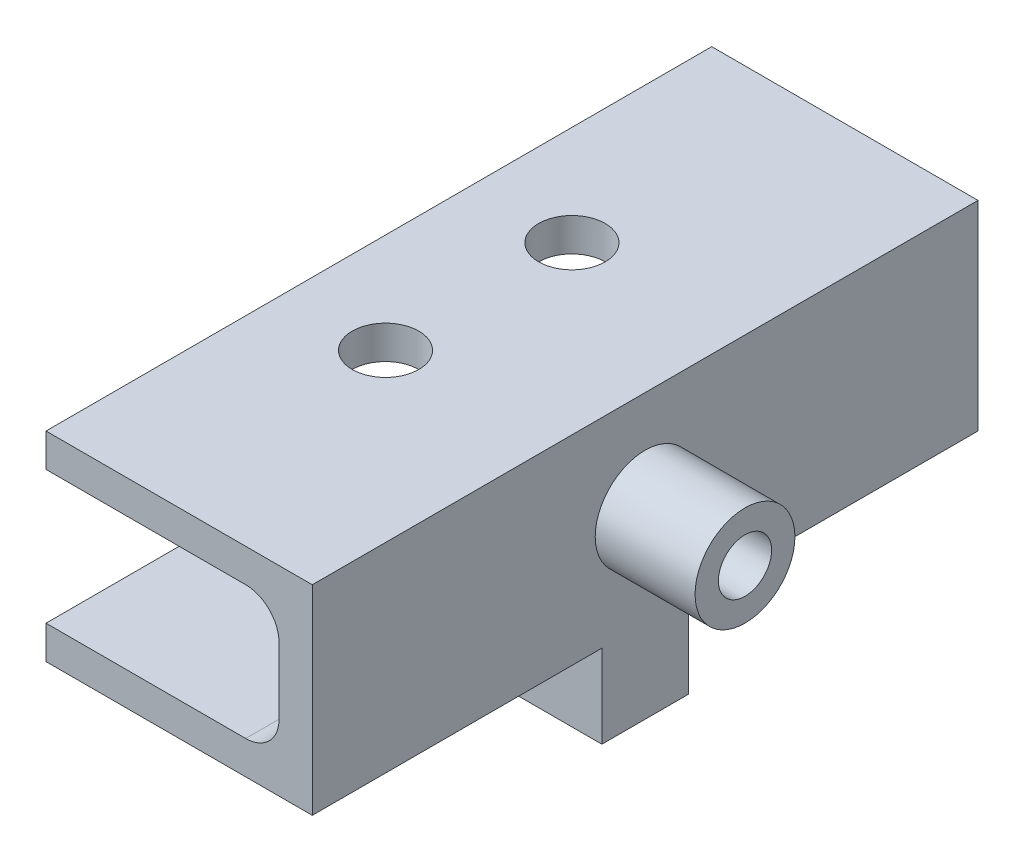
ISO-10303-21;
HEADER;
FILE_DESCRIPTION(('STEP AP214'),'2;1');
FILE_NAME('part.step','',(''),(''),'','','');
FILE_SCHEMA(('AUTOMOTIVE_DESIGN { 1 0 10303 214 1 1 1 1 }'));
ENDSEC;
DATA;
#1=APPLICATION_CONTEXT('core data for automotive mechanical design processes');
#2=APPLICATION_PROTOCOL_DEFINITION('international standard','automotive_design',2000,#1);
#3=PRODUCT_CONTEXT('',#1,'mechanical');
#4=PRODUCT('Part','Part','',(#3));
#5=PRODUCT_RELATED_PRODUCT_CATEGORY('part','',(#4));
#6=PRODUCT_DEFINITION_FORMATION('','',#4);
#7=PRODUCT_DEFINITION_CONTEXT('part definition',#1,'design');
#8=PRODUCT_DEFINITION('design','',#6,#7);
#9=PRODUCT_DEFINITION_SHAPE('','',#8);
#10=(LENGTH_UNIT() NAMED_UNIT(*) SI_UNIT(.MILLI.,.METRE.));
#11=(NAMED_UNIT(*) PLANE_ANGLE_UNIT() SI_UNIT($,.RADIAN.));
#12=(NAMED_UNIT(*) SI_UNIT($,.STERADIAN.) SOLID_ANGLE_UNIT());
#13=UNCERTAINTY_MEASURE_WITH_UNIT(LENGTH_MEASURE(1.E-05),#10,'distance_accuracy_value','');
#14=(GEOMETRIC_REPRESENTATION_CONTEXT(3) GLOBAL_UNCERTAINTY_ASSIGNED_CONTEXT((#13)) GLOBAL_UNIT_ASSIGNED_CONTEXT((#10,
#11,#12)) REPRESENTATION_CONTEXT('',''));
#15=CARTESIAN_POINT('',(0.,0.,0.));
#16=DIRECTION('',(0.,0.,1.));
#17=DIRECTION('',(1.,0.,0.));
#18=AXIS2_PLACEMENT_3D('',#15,#16,#17);
#19=CARTESIAN_POINT('',(0.,-25.,100.));
#20=DIRECTION('',(0.,1.,0.));
#21=DIRECTION('',(0.,0.,1.));
#22=AXIS2_PLACEMENT_3D('',#19,#20,#21);
#23=PLANE('',#22);
#24=CARTESIAN_POINT('',(15.,-25.,64.));
#25=DIRECTION('',(0.,1.,0.));
#26=DIRECTION('',(0.,0.,1.));
#27=AXIS2_PLACEMENT_3D('',#24,#25,#26);
#28=CIRCLE('',#27,5.);
#29=CARTESIAN_POINT('',(15.,-25.,69.));
#30=VERTEX_POINT('',#29);
#31=EDGE_CURVE('E181',#30,#30,#28,.T.);
#32=ORIENTED_EDGE('',*,*,#31,.T.);
#33=EDGE_LOOP('',(#32));
#34=FACE_BOUND('',#33,.T.);
#35=DIRECTION('',(-1.,0.,0.));
#36=VECTOR('',#35,1.);
#37=CARTESIAN_POINT('',(0.,-25.,56.5));
#38=LINE('',#37,#36);
#39=CARTESIAN_POINT('',(40.,-25.,56.5));
#40=VERTEX_POINT('',#39);
#41=CARTESIAN_POINT('',(0.,-25.,56.5));
#42=VERTEX_POINT('',#41);
#43=EDGE_CURVE('E156',#40,#42,#38,.T.);
#44=ORIENTED_EDGE('',*,*,#43,.F.);
#45=DIRECTION('',(0.,0.,-1.));
#46=VECTOR('',#45,1.);
#47=CARTESIAN_POINT('',(40.,-25.,100.));
#48=LINE('',#47,#46);
#49=CARTESIAN_POINT('',(40.,-25.,100.));
#50=VERTEX_POINT('',#49);
#51=EDGE_CURVE('E236',#50,#40,#48,.T.);
#52=ORIENTED_EDGE('',*,*,#51,.F.);
#53=DIRECTION('',(1.,0.,0.));
#54=VECTOR('',#53,1.);
#55=CARTESIAN_POINT('',(0.,-25.,100.));
#56=LINE('',#55,#54);
#57=CARTESIAN_POINT('',(0.,-25.,100.));
#58=VERTEX_POINT('',#57);
#59=EDGE_CURVE('E205',#58,#50,#56,.T.);
#60=ORIENTED_EDGE('',*,*,#59,.F.);
#61=DIRECTION('',(0.,0.,-1.));
#62=VECTOR('',#61,1.);
#63=CARTESIAN_POINT('',(0.,-25.,100.));
#64=LINE('',#63,#62);
#65=EDGE_CURVE('E58',#58,#42,#64,.T.);
#66=ORIENTED_EDGE('',*,*,#65,.T.);
#67=EDGE_LOOP('',(#44,#52,#60,#66));
#68=FACE_BOUND('',#67,.T.);
#69=ADVANCED_FACE('F35',(#34,#68),#23,.F.);
#70=CARTESIAN_POINT('',(15.,-25.,36.));
#71=DIRECTION('',(0.,1.,0.));
#72=DIRECTION('',(0.,0.,1.));
#73=AXIS2_PLACEMENT_3D('',#70,#71,#72);
#74=CIRCLE('',#73,5.);
#75=CARTESIAN_POINT('',(15.,-25.,41.));
#76=VERTEX_POINT('',#75);
#77=EDGE_CURVE('E171',#76,#76,#74,.F.);
#78=ORIENTED_EDGE('',*,*,#77,.F.);
#79=EDGE_LOOP('',(#78));
#80=FACE_BOUND('',#79,.T.);
#81=DIRECTION('',(1.,0.,0.));
#82=VECTOR('',#81,1.);
#83=CARTESIAN_POINT('',(0.,-25.,43.5));
#84=LINE('',#83,#82);
#85=CARTESIAN_POINT('',(0.,-25.,43.5));
#86=VERTEX_POINT('',#85);
#87=CARTESIAN_POINT('',(40.,-25.,43.5));
#88=VERTEX_POINT('',#87);
#89=EDGE_CURVE('E50',#86,#88,#84,.T.);
#90=ORIENTED_EDGE('',*,*,#89,.F.);
#91=CARTESIAN_POINT('',(0.,-25.,0.));
#92=VERTEX_POINT('',#91);
#93=EDGE_CURVE('E160',#86,#92,#64,.T.);
#94=ORIENTED_EDGE('',*,*,#93,.T.);
#95=DIRECTION('',(1.,0.,0.));
#96=VECTOR('',#95,1.);
#97=CARTESIAN_POINT('',(0.,-25.,0.));
#98=LINE('',#97,#96);
#99=CARTESIAN_POINT('',(40.,-25.,0.));
#100=VERTEX_POINT('',#99);
#101=EDGE_CURVE('E224',#92,#100,#98,.T.);
#102=ORIENTED_EDGE('',*,*,#101,.T.);
#103=EDGE_CURVE('E235',#88,#100,#48,.T.);
#104=ORIENTED_EDGE('',*,*,#103,.F.);
#105=EDGE_LOOP('',(#90,#94,#102,#104));
#106=FACE_BOUND('',#105,.T.);
#107=ADVANCED_FACE('F295',(#80,#106),#23,.F.);
#108=CARTESIAN_POINT('',(0.,0.,100.));
#109=DIRECTION('',(0.,1.,0.));
#110=DIRECTION('',(0.,0.,1.));
#111=AXIS2_PLACEMENT_3D('',#108,#109,#110);
#112=PLANE('',#111);
#113=DIRECTION('',(1.,0.,0.));
#114=VECTOR('',#113,1.);
#115=CARTESIAN_POINT('',(0.,0.,0.));
#116=LINE('',#115,#114);
#117=CARTESIAN_POINT('',(0.,0.,0.));
#118=VERTEX_POINT('',#117);
#119=CARTESIAN_POINT('',(30.,0.,0.));
#120=VERTEX_POINT('',#119);
#121=EDGE_CURVE('E214',#118,#120,#116,.T.);
#122=ORIENTED_EDGE('',*,*,#121,.T.);
#123=DIRECTION('',(0.,0.,-1.));
#124=VECTOR('',#123,1.);
#125=CARTESIAN_POINT('',(30.,0.,100.));
#126=LINE('',#125,#124);
#127=CARTESIAN_POINT('',(30.,0.,100.));
#128=VERTEX_POINT('',#127);
#129=EDGE_CURVE('E254',#120,#128,#126,.F.);
#130=ORIENTED_EDGE('',*,*,#129,.T.);
#131=DIRECTION('',(1.,0.,0.));
#132=VECTOR('',#131,1.);
#133=CARTESIAN_POINT('',(0.,0.,100.));
#134=LINE('',#133,#132);
#135=CARTESIAN_POINT('',(0.,0.,100.));
#136=VERTEX_POINT('',#135);
#137=EDGE_CURVE('E194',#136,#128,#134,.T.);
#138=ORIENTED_EDGE('',*,*,#137,.F.);
#139=DIRECTION('',(0.,0.,-1.));
#140=VECTOR('',#139,1.);
#141=CARTESIAN_POINT('',(0.,0.,100.));
#142=LINE('',#141,#140);
#143=EDGE_CURVE('E243',#136,#118,#142,.T.);
#144=ORIENTED_EDGE('',*,*,#143,.T.);
#145=EDGE_LOOP('',(#122,#130,#138,#144));
#146=FACE_BOUND('',#145,.T.);
#147=CARTESIAN_POINT('',(15.,0.,36.));
#148=DIRECTION('',(0.,1.,0.));
#149=DIRECTION('',(0.,0.,1.));
#150=AXIS2_PLACEMENT_3D('',#147,#148,#149);
#151=CIRCLE('',#150,5.);
#152=CARTESIAN_POINT('',(15.,0.,41.));
#153=VERTEX_POINT('',#152);
#154=EDGE_CURVE('E178',#153,#153,#151,.F.);
#155=ORIENTED_EDGE('',*,*,#154,.F.);
#156=EDGE_LOOP('',(#155));
#157=FACE_BOUND('',#156,.T.);
#158=CARTESIAN_POINT('',(15.,0.,64.));
#159=DIRECTION('',(0.,1.,0.));
#160=DIRECTION('',(0.,0.,1.));
#161=AXIS2_PLACEMENT_3D('',#158,#159,#160);
#162=CIRCLE('',#161,5.);
#163=CARTESIAN_POINT('',(15.,0.,69.));
#164=VERTEX_POINT('',#163);
#165=EDGE_CURVE('E187',#164,#164,#162,.T.);
#166=ORIENTED_EDGE('',*,*,#165,.T.);
#167=EDGE_LOOP('',(#166));
#168=FACE_BOUND('',#167,.T.);
#169=ADVANCED_FACE('F277',(#146,#157,#168),#112,.F.);
#170=CARTESIAN_POINT('',(35.,-20.,100.));
#171=DIRECTION('',(0.,-1.,0.));
#172=DIRECTION('',(1.,0.,0.));
#173=AXIS2_PLACEMENT_3D('',#170,#171,#172);
#174=PLANE('',#173);
#175=DIRECTION('',(-1.,0.,0.));
#176=VECTOR('',#175,1.);
#177=CARTESIAN_POINT('',(35.,-20.,100.));
#178=LINE('',#177,#176);
#179=CARTESIAN_POINT('',(30.,-20.,100.));
#180=VERTEX_POINT('',#179);
#181=CARTESIAN_POINT('',(0.,-20.,100.));
#182=VERTEX_POINT('',#181);
#183=EDGE_CURVE('E201',#180,#182,#178,.T.);
#184=ORIENTED_EDGE('',*,*,#183,.F.);
#185=DIRECTION('',(0.,0.,-1.));
#186=VECTOR('',#185,1.);
#187=CARTESIAN_POINT('',(30.,-20.,0.));
#188=LINE('',#187,#186);
#189=CARTESIAN_POINT('',(30.,-20.,0.));
#190=VERTEX_POINT('',#189);
#191=EDGE_CURVE('E246',#180,#190,#188,.T.);
#192=ORIENTED_EDGE('',*,*,#191,.T.);
#193=DIRECTION('',(-1.,0.,0.));
#194=VECTOR('',#193,1.);
#195=CARTESIAN_POINT('',(35.,-20.,0.));
#196=LINE('',#195,#194);
#197=CARTESIAN_POINT('',(0.,-20.,0.));
#198=VERTEX_POINT('',#197);
#199=EDGE_CURVE('E220',#190,#198,#196,.T.);
#200=ORIENTED_EDGE('',*,*,#199,.T.);
#201=DIRECTION('',(0.,0.,-1.));
#202=VECTOR('',#201,1.);
#203=CARTESIAN_POINT('',(0.,-20.,100.));
#204=LINE('',#203,#202);
#205=EDGE_CURVE('E240',#182,#198,#204,.T.);
#206=ORIENTED_EDGE('',*,*,#205,.F.);
#207=EDGE_LOOP('',(#184,#192,#200,#206));
#208=FACE_BOUND('',#207,.T.);
#209=CARTESIAN_POINT('',(15.,-20.,36.));
#210=DIRECTION('',(0.,-1.,0.));
#211=DIRECTION('',(1.,0.,0.));
#212=AXIS2_PLACEMENT_3D('',#209,#210,#211);
#213=CIRCLE('',#212,5.);
#214=CARTESIAN_POINT('',(20.,-20.,36.));
#215=VERTEX_POINT('',#214);
#216=EDGE_CURVE('E175',#215,#215,#213,.F.);
#217=ORIENTED_EDGE('',*,*,#216,.F.);
#218=EDGE_LOOP('',(#217));
#219=FACE_BOUND('',#218,.T.);
#220=CARTESIAN_POINT('',(15.,-20.,64.));
#221=DIRECTION('',(0.,-1.,0.));
#222=DIRECTION('',(1.,0.,0.));
#223=AXIS2_PLACEMENT_3D('',#220,#221,#222);
#224=CIRCLE('',#223,5.);
#225=CARTESIAN_POINT('',(20.,-20.,64.));
#226=VERTEX_POINT('',#225);
#227=EDGE_CURVE('E184',#226,#226,#224,.T.);
#228=ORIENTED_EDGE('',*,*,#227,.T.);
#229=EDGE_LOOP('',(#228));
#230=FACE_BOUND('',#229,.T.);
#231=ADVANCED_FACE('F302',(#208,#219,#230),#174,.F.);
#232=CARTESIAN_POINT('',(40.,5.00000000000001,100.));
#233=DIRECTION('',(0.,-1.,0.));
#234=DIRECTION('',(1.,0.,0.));
#235=AXIS2_PLACEMENT_3D('',#232,#233,#234);
#236=PLANE('',#235);
#237=DIRECTION('',(-1.,0.,0.));
#238=VECTOR('',#237,1.);
#239=CARTESIAN_POINT('',(40.,5.00000000000001,0.));
#240=LINE('',#239,#238);
#241=CARTESIAN_POINT('',(40.,5.00000000000001,0.));
#242=VERTEX_POINT('',#241);
#243=CARTESIAN_POINT('',(0.,5.,0.));
#244=VERTEX_POINT('',#243);
#245=EDGE_CURVE('E195',#242,#244,#240,.T.);
#246=ORIENTED_EDGE('',*,*,#245,.T.);
#247=DIRECTION('',(0.,0.,-1.));
#248=VECTOR('',#247,1.);
#249=CARTESIAN_POINT('',(0.,5.,100.));
#250=LINE('',#249,#248);
#251=CARTESIAN_POINT('',(0.,5.,100.));
#252=VERTEX_POINT('',#251);
#253=EDGE_CURVE('E211',#252,#244,#250,.T.);
#254=ORIENTED_EDGE('',*,*,#253,.F.);
#255=DIRECTION('',(-1.,0.,0.));
#256=VECTOR('',#255,1.);
#257=CARTESIAN_POINT('',(40.,5.00000000000001,100.));
#258=LINE('',#257,#256);
#259=CARTESIAN_POINT('',(40.,5.00000000000001,100.));
#260=VERTEX_POINT('',#259);
#261=EDGE_CURVE('E209',#260,#252,#258,.T.);
#262=ORIENTED_EDGE('',*,*,#261,.F.);
#263=DIRECTION('',(0.,0.,-1.));
#264=VECTOR('',#263,1.);
#265=CARTESIAN_POINT('',(40.,5.00000000000001,100.));
#266=LINE('',#265,#264);
#267=EDGE_CURVE('E232',#260,#242,#266,.T.);
#268=ORIENTED_EDGE('',*,*,#267,.T.);
#269=EDGE_LOOP('',(#246,#254,#262,#268));
#270=FACE_BOUND('',#269,.T.);
#271=CARTESIAN_POINT('',(15.,5.,36.));
#272=DIRECTION('',(0.,-1.,0.));
#273=DIRECTION('',(1.,0.,0.));
#274=AXIS2_PLACEMENT_3D('',#271,#272,#273);
#275=CIRCLE('',#274,5.);
#276=CARTESIAN_POINT('',(20.,5.,36.));
#277=VERTEX_POINT('',#276);
#278=EDGE_CURVE('E161',#277,#277,#275,.T.);
#279=ORIENTED_EDGE('',*,*,#278,.T.);
#280=EDGE_LOOP('',(#279));
#281=FACE_BOUND('',#280,.T.);
#282=CARTESIAN_POINT('',(15.,5.,64.));
#283=DIRECTION('',(0.,1.,0.));
#284=DIRECTION('',(-1.,0.,0.));
#285=AXIS2_PLACEMENT_3D('',#282,#283,#284);
#286=CIRCLE('',#285,5.);
#287=CARTESIAN_POINT('',(10.,5.,64.));
#288=VERTEX_POINT('',#287);
#289=EDGE_CURVE('E164',#288,#288,#286,.T.);
#290=ORIENTED_EDGE('',*,*,#289,.F.);
#291=EDGE_LOOP('',(#290));
#292=FACE_BOUND('',#291,.T.);
#293=ADVANCED_FACE('F288',(#270,#281,#292),#236,.F.);
#294=CARTESIAN_POINT('',(0.,5.,100.));
#295=DIRECTION('',(1.,0.,0.));
#296=DIRECTION('',(0.,0.,-1.));
#297=AXIS2_PLACEMENT_3D('',#294,#295,#296);
#298=PLANE('',#297);
#299=DIRECTION('',(0.,-1.,0.));
#300=VECTOR('',#299,1.);
#301=CARTESIAN_POINT('',(0.,5.,0.));
#302=LINE('',#301,#300);
#303=EDGE_CURVE('E190',#244,#118,#302,.T.);
#304=ORIENTED_EDGE('',*,*,#303,.T.);
#305=ORIENTED_EDGE('',*,*,#143,.F.);
#306=DIRECTION('',(0.,-1.,0.));
#307=VECTOR('',#306,1.);
#308=CARTESIAN_POINT('',(0.,5.,100.));
#309=LINE('',#308,#307);
#310=EDGE_CURVE('E191',#252,#136,#309,.T.);
#311=ORIENTED_EDGE('',*,*,#310,.F.);
#312=ORIENTED_EDGE('',*,*,#253,.T.);
#313=EDGE_LOOP('',(#304,#305,#311,#312));
#314=FACE_BOUND('',#313,.T.);
#315=ADVANCED_FACE('F282',(#314),#298,.F.);
#316=CARTESIAN_POINT('',(35.,0.,100.));
#317=DIRECTION('',(1.,0.,0.));
#318=DIRECTION('',(0.,1.,0.));
#319=AXIS2_PLACEMENT_3D('',#316,#317,#318);
#320=PLANE('',#319);
#321=DIRECTION('',(0.,-1.,0.));
#322=VECTOR('',#321,1.);
#323=CARTESIAN_POINT('',(35.,0.,0.));
#324=LINE('',#323,#322);
#325=CARTESIAN_POINT('',(35.,-5.,0.));
#326=VERTEX_POINT('',#325);
#327=CARTESIAN_POINT('',(35.,-15.,0.));
#328=VERTEX_POINT('',#327);
#329=EDGE_CURVE('E217',#326,#328,#324,.T.);
#330=ORIENTED_EDGE('',*,*,#329,.T.);
#331=DIRECTION('',(0.,0.,-1.));
#332=VECTOR('',#331,1.);
#333=CARTESIAN_POINT('',(35.,-15.,100.));
#334=LINE('',#333,#332);
#335=CARTESIAN_POINT('',(35.,-15.,100.));
#336=VERTEX_POINT('',#335);
#337=EDGE_CURVE('E252',#328,#336,#334,.F.);
#338=ORIENTED_EDGE('',*,*,#337,.T.);
#339=DIRECTION('',(0.,-1.,0.));
#340=VECTOR('',#339,1.);
#341=CARTESIAN_POINT('',(35.,0.,100.));
#342=LINE('',#341,#340);
#343=CARTESIAN_POINT('',(35.,-5.,100.));
#344=VERTEX_POINT('',#343);
#345=EDGE_CURVE('E198',#344,#336,#342,.T.);
#346=ORIENTED_EDGE('',*,*,#345,.F.);
#347=DIRECTION('',(0.,0.,-1.));
#348=VECTOR('',#347,1.);
#349=CARTESIAN_POINT('',(35.,-5.,0.));
#350=LINE('',#349,#348);
#351=EDGE_CURVE('E249',#344,#326,#350,.T.);
#352=ORIENTED_EDGE('',*,*,#351,.T.);
#353=EDGE_LOOP('',(#330,#338,#346,#352));
#354=FACE_BOUND('',#353,.T.);
#355=ADVANCED_FACE('F270',(#354),#320,.F.);
#356=CARTESIAN_POINT('',(0.,-20.,100.));
#357=DIRECTION('',(1.,0.,0.));
#358=DIRECTION('',(0.,1.,0.));
#359=AXIS2_PLACEMENT_3D('',#356,#357,#358);
#360=PLANE('',#359);
#361=DIRECTION('',(0.,-1.,0.));
#362=VECTOR('',#361,1.);
#363=CARTESIAN_POINT('',(0.,-20.,0.));
#364=LINE('',#363,#362);
#365=EDGE_CURVE('E222',#198,#92,#364,.T.);
#366=ORIENTED_EDGE('',*,*,#365,.T.);
#367=ORIENTED_EDGE('',*,*,#93,.F.);
#368=DIRECTION('',(0.,1.,0.));
#369=VECTOR('',#368,1.);
#370=CARTESIAN_POINT('',(0.,-37.5,43.5));
#371=LINE('',#370,#369);
#372=CARTESIAN_POINT('',(0.,-37.5,43.5));
#373=VERTEX_POINT('',#372);
#374=EDGE_CURVE('E141',#373,#86,#371,.T.);
#375=ORIENTED_EDGE('',*,*,#374,.F.);
#376=DIRECTION('',(0.,0.,-1.));
#377=VECTOR('',#376,1.);
#378=CARTESIAN_POINT('',(0.,-37.5,43.5));
#379=LINE('',#378,#377);
#380=CARTESIAN_POINT('',(0.,-37.5,56.5));
#381=VERTEX_POINT('',#380);
#382=EDGE_CURVE('E147',#381,#373,#379,.T.);
#383=ORIENTED_EDGE('',*,*,#382,.F.);
#384=DIRECTION('',(0.,1.,0.));
#385=VECTOR('',#384,1.);
#386=CARTESIAN_POINT('',(0.,-37.5,56.5));
#387=LINE('',#386,#385);
#388=EDGE_CURVE('E308',#381,#42,#387,.T.);
#389=ORIENTED_EDGE('',*,*,#388,.T.);
#390=ORIENTED_EDGE('',*,*,#65,.F.);
#391=DIRECTION('',(0.,-1.,0.));
#392=VECTOR('',#391,1.);
#393=CARTESIAN_POINT('',(0.,-20.,100.));
#394=LINE('',#393,#392);
#395=EDGE_CURVE('E203',#182,#58,#394,.T.);
#396=ORIENTED_EDGE('',*,*,#395,.F.);
#397=ORIENTED_EDGE('',*,*,#205,.T.);
#398=EDGE_LOOP('',(#366,#367,#375,#383,#389,#390,#396,#397));
#399=FACE_BOUND('',#398,.T.);
#400=ADVANCED_FACE('F159',(#399),#360,.F.);
#401=CARTESIAN_POINT('',(40.,-25.,100.));
#402=DIRECTION('',(-1.,0.,0.));
#403=DIRECTION('',(0.,0.,1.));
#404=AXIS2_PLACEMENT_3D('',#401,#402,#403);
#405=PLANE('',#404);
#406=CARTESIAN_POINT('',(40.,-10.,50.));
#407=DIRECTION('',(-1.,0.,0.));
#408=DIRECTION('',(0.,0.,1.));
#409=AXIS2_PLACEMENT_3D('',#406,#407,#408);
#410=CIRCLE('',#409,7.5);
#411=CARTESIAN_POINT('',(40.,-10.,57.5));
#412=VERTEX_POINT('',#411);
#413=EDGE_CURVE('E11',#412,#412,#410,.F.);
#414=ORIENTED_EDGE('',*,*,#413,.F.);
#415=EDGE_LOOP('',(#414));
#416=FACE_BOUND('',#415,.T.);
#417=DIRECTION('',(0.,1.,0.));
#418=VECTOR('',#417,1.);
#419=CARTESIAN_POINT('',(40.,-25.,0.));
#420=LINE('',#419,#418);
#421=EDGE_CURVE('E227',#100,#242,#420,.T.);
#422=ORIENTED_EDGE('',*,*,#421,.T.);
#423=ORIENTED_EDGE('',*,*,#267,.F.);
#424=DIRECTION('',(0.,1.,0.));
#425=VECTOR('',#424,1.);
#426=CARTESIAN_POINT('',(40.,-25.,100.));
#427=LINE('',#426,#425);
#428=EDGE_CURVE('E207',#50,#260,#427,.T.);
#429=ORIENTED_EDGE('',*,*,#428,.F.);
#430=ORIENTED_EDGE('',*,*,#51,.T.);
#431=DIRECTION('',(0.,1.,0.));
#432=VECTOR('',#431,1.);
#433=CARTESIAN_POINT('',(40.,-37.5,56.5));
#434=LINE('',#433,#432);
#435=CARTESIAN_POINT('',(40.,-37.5,56.5));
#436=VERTEX_POINT('',#435);
#437=EDGE_CURVE('E166',#436,#40,#434,.T.);
#438=ORIENTED_EDGE('',*,*,#437,.F.);
#439=DIRECTION('',(0.,0.,1.));
#440=VECTOR('',#439,1.);
#441=CARTESIAN_POINT('',(40.,-37.5,43.5));
#442=LINE('',#441,#440);
#443=CARTESIAN_POINT('',(40.,-37.5,43.5));
#444=VERTEX_POINT('',#443);
#445=EDGE_CURVE('E146',#444,#436,#442,.T.);
#446=ORIENTED_EDGE('',*,*,#445,.F.);
#447=DIRECTION('',(0.,1.,0.));
#448=VECTOR('',#447,1.);
#449=CARTESIAN_POINT('',(40.,-37.5,43.5));
#450=LINE('',#449,#448);
#451=EDGE_CURVE('E143',#444,#88,#450,.T.);
#452=ORIENTED_EDGE('',*,*,#451,.T.);
#453=ORIENTED_EDGE('',*,*,#103,.T.);
#454=EDGE_LOOP('',(#422,#423,#429,#430,#438,#446,#452,#453));
#455=FACE_BOUND('',#454,.T.);
#456=ADVANCED_FACE('F294',(#416,#455),#405,.F.);
#457=CARTESIAN_POINT('',(0.,0.,100.));
#458=DIRECTION('',(0.,0.,1.));
#459=DIRECTION('',(1.,0.,0.));
#460=AXIS2_PLACEMENT_3D('',#457,#458,#459);
#461=PLANE('',#460);
#462=ORIENTED_EDGE('',*,*,#310,.T.);
#463=ORIENTED_EDGE('',*,*,#137,.T.);
#464=CARTESIAN_POINT('',(30.,-5.,100.));
#465=DIRECTION('',(0.,0.,1.));
#466=DIRECTION('',(1.,0.,0.));
#467=AXIS2_PLACEMENT_3D('',#464,#465,#466);
#468=CIRCLE('',#467,5.);
#469=EDGE_CURVE('E43',#128,#344,#468,.F.);
#470=ORIENTED_EDGE('',*,*,#469,.T.);
#471=ORIENTED_EDGE('',*,*,#345,.T.);
#472=CARTESIAN_POINT('',(30.,-15.,100.));
#473=DIRECTION('',(0.,0.,1.));
#474=DIRECTION('',(1.,0.,0.));
#475=AXIS2_PLACEMENT_3D('',#472,#473,#474);
#476=CIRCLE('',#475,5.);
#477=EDGE_CURVE('E258',#336,#180,#476,.F.);
#478=ORIENTED_EDGE('',*,*,#477,.T.);
#479=ORIENTED_EDGE('',*,*,#183,.T.);
#480=ORIENTED_EDGE('',*,*,#395,.T.);
#481=ORIENTED_EDGE('',*,*,#59,.T.);
#482=ORIENTED_EDGE('',*,*,#428,.T.);
#483=ORIENTED_EDGE('',*,*,#261,.T.);
#484=EDGE_LOOP('',(#462,#463,#470,#471,#478,#479,#480,#481,#482,#483));
#485=FACE_BOUND('',#484,.T.);
#486=ADVANCED_FACE('F264',(#485),#461,.T.);
#487=CARTESIAN_POINT('',(0.,0.,0.));
#488=DIRECTION('',(0.,0.,1.));
#489=DIRECTION('',(1.,0.,0.));
#490=AXIS2_PLACEMENT_3D('',#487,#488,#489);
#491=PLANE('',#490);
#492=ORIENTED_EDGE('',*,*,#303,.F.);
#493=ORIENTED_EDGE('',*,*,#245,.F.);
#494=ORIENTED_EDGE('',*,*,#421,.F.);
#495=ORIENTED_EDGE('',*,*,#101,.F.);
#496=ORIENTED_EDGE('',*,*,#365,.F.);
#497=ORIENTED_EDGE('',*,*,#199,.F.);
#498=CARTESIAN_POINT('',(30.,-15.,0.));
#499=DIRECTION('',(0.,0.,1.));
#500=DIRECTION('',(1.,0.,0.));
#501=AXIS2_PLACEMENT_3D('',#498,#499,#500);
#502=CIRCLE('',#501,5.);
#503=EDGE_CURVE('E256',#190,#328,#502,.T.);
#504=ORIENTED_EDGE('',*,*,#503,.T.);
#505=ORIENTED_EDGE('',*,*,#329,.F.);
#506=CARTESIAN_POINT('',(30.,-5.,0.));
#507=DIRECTION('',(0.,0.,1.));
#508=DIRECTION('',(1.,0.,0.));
#509=AXIS2_PLACEMENT_3D('',#506,#507,#508);
#510=CIRCLE('',#509,5.);
#511=EDGE_CURVE('E260',#326,#120,#510,.T.);
#512=ORIENTED_EDGE('',*,*,#511,.T.);
#513=ORIENTED_EDGE('',*,*,#121,.F.);
#514=EDGE_LOOP('',(#492,#493,#494,#495,#496,#497,#504,#505,#512,#513));
#515=FACE_BOUND('',#514,.T.);
#516=ADVANCED_FACE('F275',(#515),#491,.F.);
#517=CARTESIAN_POINT('',(30.,-15.,100.));
#518=DIRECTION('',(0.,0.,1.));
#519=DIRECTION('',(1.,0.,0.));
#520=AXIS2_PLACEMENT_3D('',#517,#518,#519);
#521=CYLINDRICAL_SURFACE('',#520,5.);
#522=ORIENTED_EDGE('',*,*,#477,.F.);
#523=ORIENTED_EDGE('',*,*,#337,.F.);
#524=ORIENTED_EDGE('',*,*,#503,.F.);
#525=ORIENTED_EDGE('',*,*,#191,.F.);
#526=EDGE_LOOP('',(#522,#523,#524,#525));
#527=FACE_BOUND('',#526,.T.);
#528=ADVANCED_FACE('F306',(#527),#521,.F.);
#529=CARTESIAN_POINT('',(30.,-5.,100.));
#530=DIRECTION('',(0.,0.,1.));
#531=DIRECTION('',(1.,0.,0.));
#532=AXIS2_PLACEMENT_3D('',#529,#530,#531);
#533=CYLINDRICAL_SURFACE('',#532,5.);
#534=ORIENTED_EDGE('',*,*,#469,.F.);
#535=ORIENTED_EDGE('',*,*,#129,.F.);
#536=ORIENTED_EDGE('',*,*,#511,.F.);
#537=ORIENTED_EDGE('',*,*,#351,.F.);
#538=EDGE_LOOP('',(#534,#535,#536,#537));
#539=FACE_BOUND('',#538,.T.);
#540=ADVANCED_FACE('F37',(#539),#533,.F.);
#541=CARTESIAN_POINT('',(15.,-70.,36.));
#542=DIRECTION('',(0.,1.,0.));
#543=DIRECTION('',(-1.,0.,0.));
#544=AXIS2_PLACEMENT_3D('',#541,#542,#543);
#545=CYLINDRICAL_SURFACE('',#544,5.);
#546=ORIENTED_EDGE('',*,*,#278,.F.);
#547=EDGE_LOOP('',(#546));
#548=FACE_BOUND('',#547,.T.);
#549=ORIENTED_EDGE('',*,*,#154,.T.);
#550=EDGE_LOOP('',(#549));
#551=FACE_BOUND('',#550,.T.);
#552=ADVANCED_FACE('F378',(#548,#551),#545,.F.);
#553=CARTESIAN_POINT('',(15.,-70.,64.));
#554=DIRECTION('',(0.,1.,0.));
#555=DIRECTION('',(-1.,0.,0.));
#556=AXIS2_PLACEMENT_3D('',#553,#554,#555);
#557=CYLINDRICAL_SURFACE('',#556,5.);
#558=ORIENTED_EDGE('',*,*,#289,.T.);
#559=EDGE_LOOP('',(#558));
#560=FACE_BOUND('',#559,.T.);
#561=ORIENTED_EDGE('',*,*,#165,.F.);
#562=EDGE_LOOP('',(#561));
#563=FACE_BOUND('',#562,.T.);
#564=ADVANCED_FACE('F469',(#560,#563),#557,.F.);
#565=ORIENTED_EDGE('',*,*,#77,.T.);
#566=EDGE_LOOP('',(#565));
#567=FACE_BOUND('',#566,.T.);
#568=ORIENTED_EDGE('',*,*,#216,.T.);
#569=EDGE_LOOP('',(#568));
#570=FACE_BOUND('',#569,.T.);
#571=ADVANCED_FACE('F471',(#567,#570),#545,.F.);
#572=ORIENTED_EDGE('',*,*,#31,.F.);
#573=EDGE_LOOP('',(#572));
#574=FACE_BOUND('',#573,.T.);
#575=ORIENTED_EDGE('',*,*,#227,.F.);
#576=EDGE_LOOP('',(#575));
#577=FACE_BOUND('',#576,.T.);
#578=ADVANCED_FACE('F417',(#574,#577),#557,.F.);
#579=CARTESIAN_POINT('',(0.,-37.5,43.5));
#580=DIRECTION('',(0.,0.,1.));
#581=DIRECTION('',(1.,0.,0.));
#582=AXIS2_PLACEMENT_3D('',#579,#580,#581);
#583=PLANE('',#582);
#584=ORIENTED_EDGE('',*,*,#89,.T.);
#585=ORIENTED_EDGE('',*,*,#451,.F.);
#586=DIRECTION('',(1.,0.,0.));
#587=VECTOR('',#586,1.);
#588=CARTESIAN_POINT('',(0.,-37.5,43.5));
#589=LINE('',#588,#587);
#590=EDGE_CURVE('E137',#373,#444,#589,.T.);
#591=ORIENTED_EDGE('',*,*,#590,.F.);
#592=ORIENTED_EDGE('',*,*,#374,.T.);
#593=EDGE_LOOP('',(#584,#585,#591,#592));
#594=FACE_BOUND('',#593,.T.);
#595=ADVANCED_FACE('F139',(#594),#583,.F.);
#596=CARTESIAN_POINT('',(0.,-37.5,56.5));
#597=DIRECTION('',(0.,0.,-1.));
#598=DIRECTION('',(-1.,0.,0.));
#599=AXIS2_PLACEMENT_3D('',#596,#597,#598);
#600=PLANE('',#599);
#601=ORIENTED_EDGE('',*,*,#43,.T.);
#602=ORIENTED_EDGE('',*,*,#388,.F.);
#603=DIRECTION('',(-1.,0.,0.));
#604=VECTOR('',#603,1.);
#605=CARTESIAN_POINT('',(0.,-37.5,56.5));
#606=LINE('',#605,#604);
#607=EDGE_CURVE('E152',#436,#381,#606,.T.);
#608=ORIENTED_EDGE('',*,*,#607,.F.);
#609=ORIENTED_EDGE('',*,*,#437,.T.);
#610=EDGE_LOOP('',(#601,#602,#608,#609));
#611=FACE_BOUND('',#610,.T.);
#612=ADVANCED_FACE('F312',(#611),#600,.F.);
#613=CARTESIAN_POINT('',(0.,-37.5,0.));
#614=DIRECTION('',(0.,1.,0.));
#615=DIRECTION('',(0.,0.,1.));
#616=AXIS2_PLACEMENT_3D('',#613,#614,#615);
#617=PLANE('',#616);
#618=ORIENTED_EDGE('',*,*,#382,.T.);
#619=ORIENTED_EDGE('',*,*,#590,.T.);
#620=ORIENTED_EDGE('',*,*,#445,.T.);
#621=ORIENTED_EDGE('',*,*,#607,.T.);
#622=EDGE_LOOP('',(#618,#619,#620,#621));
#623=FACE_BOUND('',#622,.T.);
#624=ADVANCED_FACE('F150',(#623),#617,.F.);
#625=CARTESIAN_POINT('',(55.,-10.,50.));
#626=DIRECTION('',(-1.,0.,0.));
#627=DIRECTION('',(0.,0.,1.));
#628=AXIS2_PLACEMENT_3D('',#625,#626,#627);
#629=CYLINDRICAL_SURFACE('',#628,7.5);
#630=CARTESIAN_POINT('',(55.,-10.,50.));
#631=DIRECTION('',(1.,0.,0.));
#632=DIRECTION('',(0.,0.,-1.));
#633=AXIS2_PLACEMENT_3D('',#630,#631,#632);
#634=CIRCLE('',#633,7.5);
#635=CARTESIAN_POINT('',(55.,-10.,42.5));
#636=VERTEX_POINT('',#635);
#637=EDGE_CURVE('E317',#636,#636,#634,.T.);
#638=ORIENTED_EDGE('',*,*,#637,.F.);
#639=EDGE_LOOP('',(#638));
#640=FACE_BOUND('',#639,.T.);
#641=ORIENTED_EDGE('',*,*,#413,.T.);
#642=EDGE_LOOP('',(#641));
#643=FACE_BOUND('',#642,.T.);
#644=ADVANCED_FACE('F340',(#640,#643),#629,.T.);
#645=CARTESIAN_POINT('',(55.,-10.,50.));
#646=DIRECTION('',(1.,0.,0.));
#647=DIRECTION('',(0.,0.,-1.));
#648=AXIS2_PLACEMENT_3D('',#645,#646,#647);
#649=PLANE('',#648);
#650=CARTESIAN_POINT('',(55.,-10.,50.));
#651=DIRECTION('',(1.,0.,0.));
#652=DIRECTION('',(0.,0.,-1.));
#653=AXIS2_PLACEMENT_3D('',#650,#651,#652);
#654=CIRCLE('',#653,4.);
#655=CARTESIAN_POINT('',(55.,-10.,46.));
#656=VERTEX_POINT('',#655);
#657=EDGE_CURVE('E323',#656,#656,#654,.T.);
#658=ORIENTED_EDGE('',*,*,#657,.F.);
#659=EDGE_LOOP('',(#658));
#660=FACE_BOUND('',#659,.T.);
#661=ORIENTED_EDGE('',*,*,#637,.T.);
#662=EDGE_LOOP('',(#661));
#663=FACE_BOUND('',#662,.T.);
#664=ADVANCED_FACE('F334',(#660,#663),#649,.T.);
#665=CARTESIAN_POINT('',(40.,-10.,50.));
#666=DIRECTION('',(1.,0.,0.));
#667=DIRECTION('',(0.,0.,-1.));
#668=AXIS2_PLACEMENT_3D('',#665,#666,#667);
#669=CYLINDRICAL_SURFACE('',#668,4.);
#670=CARTESIAN_POINT('',(40.,-10.,50.));
#671=DIRECTION('',(1.,0.,0.));
#672=DIRECTION('',(0.,0.,-1.));
#673=AXIS2_PLACEMENT_3D('',#670,#671,#672);
#674=CIRCLE('',#673,4.);
#675=CARTESIAN_POINT('',(40.,-10.,46.));
#676=VERTEX_POINT('',#675);
#677=EDGE_CURVE('E322',#676,#676,#674,.T.);
#678=ORIENTED_EDGE('',*,*,#677,.F.);
#679=EDGE_LOOP('',(#678));
#680=FACE_BOUND('',#679,.T.);
#681=ORIENTED_EDGE('',*,*,#657,.T.);
#682=EDGE_LOOP('',(#681));
#683=FACE_BOUND('',#682,.T.);
#684=ADVANCED_FACE('F331',(#680,#683),#669,.F.);
#685=CARTESIAN_POINT('',(40.,-10.,50.));
#686=DIRECTION('',(1.,0.,0.));
#687=DIRECTION('',(0.,0.,-1.));
#688=AXIS2_PLACEMENT_3D('',#685,#686,#687);
#689=PLANE('',#688);
#690=ORIENTED_EDGE('',*,*,#677,.T.);
#691=EDGE_LOOP('',(#690));
#692=FACE_BOUND('',#691,.T.);
#693=ADVANCED_FACE('F329',(#692),#689,.T.);
#694=CLOSED_SHELL('',(#69,#107,#169,#231,#293,#315,#355,#400,#456,#486,#516,#528,#540,#552,#564,
#571,#578,#595,#612,#624,#644,#664,#684,#693));
#695=MANIFOLD_SOLID_BREP('B2',#694);
#696=ADVANCED_BREP_SHAPE_REPRESENTATION('',(#18,#695),#14);
#697=SHAPE_DEFINITION_REPRESENTATION(#9,#696);
ENDSEC;
END-ISO-10303-21;
